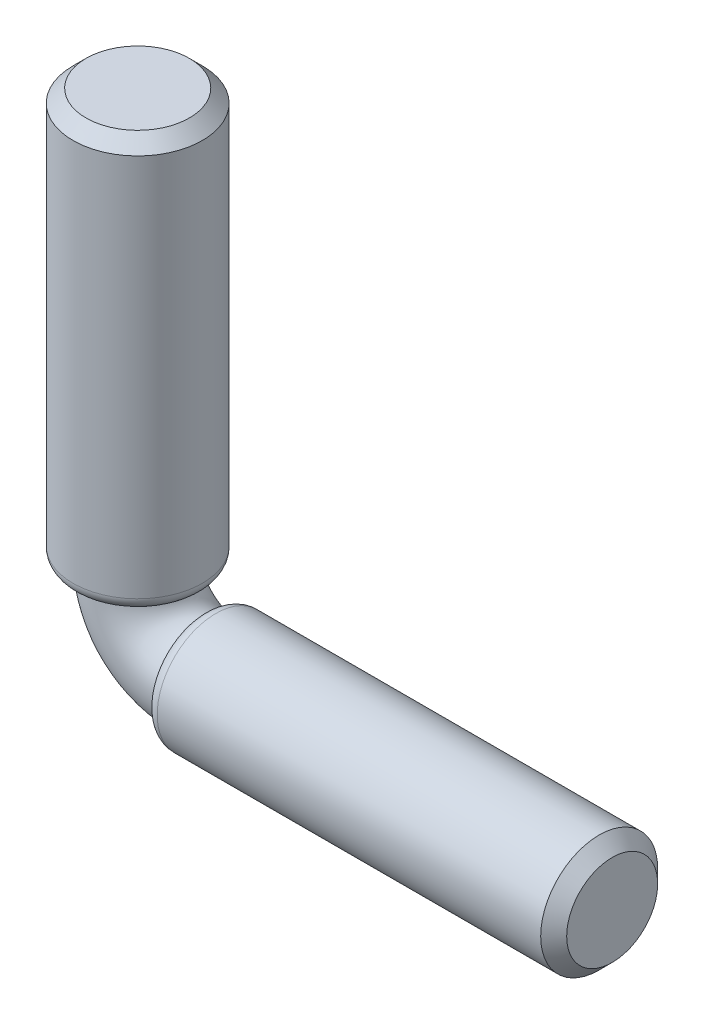
ISO-10303-21;
HEADER;
FILE_DESCRIPTION(('STEP AP214'),'2;1');
FILE_NAME('part.step','',(''),(''),'','','');
FILE_SCHEMA(('AUTOMOTIVE_DESIGN { 1 0 10303 214 1 1 1 1 }'));
ENDSEC;
DATA;
#1=APPLICATION_CONTEXT('core data for automotive mechanical design processes');
#2=APPLICATION_PROTOCOL_DEFINITION('international standard','automotive_design',2000,#1);
#3=PRODUCT_CONTEXT('',#1,'mechanical');
#4=PRODUCT('Part','Part','',(#3));
#5=PRODUCT_RELATED_PRODUCT_CATEGORY('part','',(#4));
#6=PRODUCT_DEFINITION_FORMATION('','',#4);
#7=PRODUCT_DEFINITION_CONTEXT('part definition',#1,'design');
#8=PRODUCT_DEFINITION('design','',#6,#7);
#9=PRODUCT_DEFINITION_SHAPE('','',#8);
#10=(LENGTH_UNIT() NAMED_UNIT(*) SI_UNIT(.MILLI.,.METRE.));
#11=(NAMED_UNIT(*) PLANE_ANGLE_UNIT() SI_UNIT($,.RADIAN.));
#12=(NAMED_UNIT(*) SI_UNIT($,.STERADIAN.) SOLID_ANGLE_UNIT());
#13=UNCERTAINTY_MEASURE_WITH_UNIT(LENGTH_MEASURE(1.E-05),#10,'distance_accuracy_value','');
#14=(GEOMETRIC_REPRESENTATION_CONTEXT(3) GLOBAL_UNCERTAINTY_ASSIGNED_CONTEXT((#13)) GLOBAL_UNIT_ASSIGNED_CONTEXT((#10,
#11,#12)) REPRESENTATION_CONTEXT('',''));
#15=CARTESIAN_POINT('',(0.,0.,0.));
#16=DIRECTION('',(0.,0.,1.));
#17=DIRECTION('',(1.,0.,0.));
#18=AXIS2_PLACEMENT_3D('',#15,#16,#17);
#19=CARTESIAN_POINT('',(5.,0.,0.));
#20=DIRECTION('',(0.,0.,1.));
#21=DIRECTION('',(1.,0.,0.));
#22=AXIS2_PLACEMENT_3D('',#19,#20,#21);
#23=TOROIDAL_SURFACE('',#22,5.,3.5);
#24=CARTESIAN_POINT('',(0.,0.,0.));
#25=DIRECTION('',(0.,1.,0.));
#26=DIRECTION('',(0.,0.,1.));
#27=AXIS2_PLACEMENT_3D('',#24,#25,#26);
#28=CIRCLE('',#27,3.5);
#29=CARTESIAN_POINT('',(-3.5,0.,0.));
#30=VERTEX_POINT('',#29);
#31=EDGE_CURVE('E74',#30,#30,#28,.T.);
#32=CARTESIAN_POINT('',(5.,-5.,0.));
#33=DIRECTION('',(1.,0.,0.));
#34=DIRECTION('',(0.,0.,-1.));
#35=AXIS2_PLACEMENT_3D('',#32,#33,#34);
#36=CIRCLE('',#35,3.5);
#37=CARTESIAN_POINT('',(5.00000000000001,-8.5,0.));
#38=VERTEX_POINT('',#37);
#39=EDGE_CURVE('E77',#38,#38,#36,.T.);
#40=CARTESIAN_POINT('',(5.,0.,0.));
#41=DIRECTION('',(0.,0.,1.));
#42=DIRECTION('',(1.,0.,0.));
#43=AXIS2_PLACEMENT_3D('',#40,#41,#42);
#44=CIRCLE('',#43,8.5);
#45=EDGE_CURVE('',#30,#38,#44,.T.);
#46=ORIENTED_EDGE('',*,*,#31,.F.);
#47=ORIENTED_EDGE('',*,*,#39,.F.);
#48=ORIENTED_EDGE('',*,*,#45,.T.);
#49=ORIENTED_EDGE('',*,*,#45,.F.);
#50=EDGE_LOOP('',(#46,#48,#47,#49));
#51=FACE_BOUND('',#50,.T.);
#52=ADVANCED_FACE('F45',(#51),#23,.T.);
#53=CARTESIAN_POINT('',(0.,0.,0.));
#54=DIRECTION('',(0.,1.,0.));
#55=DIRECTION('',(-1.,0.,0.));
#56=AXIS2_PLACEMENT_3D('',#53,#54,#55);
#57=CYLINDRICAL_SURFACE('',#56,4.97554770830788);
#58=CARTESIAN_POINT('',(0.,1.,0.));
#59=DIRECTION('',(0.,1.,0.));
#60=DIRECTION('',(-1.,0.,0.));
#61=AXIS2_PLACEMENT_3D('',#58,#59,#60);
#62=CIRCLE('',#61,4.97554770830788);
#63=CARTESIAN_POINT('',(-4.97554770830788,1.,0.));
#64=VERTEX_POINT('',#63);
#65=EDGE_CURVE('E52',#64,#64,#62,.T.);
#66=ORIENTED_EDGE('',*,*,#65,.T.);
#67=EDGE_LOOP('',(#66));
#68=FACE_BOUND('',#67,.T.);
#69=CARTESIAN_POINT('',(0.,30.5,0.));
#70=DIRECTION('',(0.,1.,0.));
#71=DIRECTION('',(-1.,0.,0.));
#72=AXIS2_PLACEMENT_3D('',#69,#70,#71);
#73=CIRCLE('',#72,4.97554770830788);
#74=CARTESIAN_POINT('',(-4.97554770830788,30.5,0.));
#75=VERTEX_POINT('',#74);
#76=EDGE_CURVE('E68',#75,#75,#73,.F.);
#77=ORIENTED_EDGE('',*,*,#76,.T.);
#78=EDGE_LOOP('',(#77));
#79=FACE_BOUND('',#78,.T.);
#80=ADVANCED_FACE('F86',(#68,#79),#57,.T.);
#81=CARTESIAN_POINT('',(0.,0.,0.));
#82=DIRECTION('',(0.,1.,0.));
#83=DIRECTION('',(-1.,0.,0.));
#84=AXIS2_PLACEMENT_3D('',#81,#82,#83);
#85=PLANE('',#84);
#86=CARTESIAN_POINT('',(0.,0.,0.));
#87=DIRECTION('',(0.,1.,0.));
#88=DIRECTION('',(-1.,0.,0.));
#89=AXIS2_PLACEMENT_3D('',#86,#87,#88);
#90=CIRCLE('',#89,3.97554770830788);
#91=CARTESIAN_POINT('',(-3.97554770830788,0.,0.));
#92=VERTEX_POINT('',#91);
#93=EDGE_CURVE('E11',#92,#92,#90,.F.);
#94=ORIENTED_EDGE('',*,*,#93,.T.);
#95=EDGE_LOOP('',(#94));
#96=FACE_BOUND('',#95,.T.);
#97=ORIENTED_EDGE('',*,*,#31,.T.);
#98=EDGE_LOOP('',(#97));
#99=FACE_BOUND('',#98,.T.);
#100=ADVANCED_FACE('F90',(#96,#99),#85,.F.);
#101=CARTESIAN_POINT('',(0.,31.5,0.));
#102=DIRECTION('',(0.,1.,0.));
#103=DIRECTION('',(0.,0.,1.));
#104=AXIS2_PLACEMENT_3D('',#101,#102,#103);
#105=PLANE('',#104);
#106=CARTESIAN_POINT('',(0.,31.5,0.));
#107=DIRECTION('',(0.,1.,0.));
#108=DIRECTION('',(-1.,0.,0.));
#109=AXIS2_PLACEMENT_3D('',#106,#107,#108);
#110=CIRCLE('',#109,3.97554770830786);
#111=CARTESIAN_POINT('',(-3.97554770830786,31.5,0.));
#112=VERTEX_POINT('',#111);
#113=EDGE_CURVE('E71',#112,#112,#110,.T.);
#114=ORIENTED_EDGE('',*,*,#113,.T.);
#115=EDGE_LOOP('',(#114));
#116=FACE_BOUND('',#115,.T.);
#117=ADVANCED_FACE('F92',(#116),#105,.T.);
#118=CARTESIAN_POINT('',(5.,-5.,0.));
#119=DIRECTION('',(1.,0.,0.));
#120=DIRECTION('',(0.,0.,-1.));
#121=AXIS2_PLACEMENT_3D('',#118,#119,#120);
#122=CYLINDRICAL_SURFACE('',#121,4.5);
#123=CARTESIAN_POINT('',(6.,-5.,0.));
#124=DIRECTION('',(1.,0.,0.));
#125=DIRECTION('',(0.,0.,-1.));
#126=AXIS2_PLACEMENT_3D('',#123,#124,#125);
#127=CIRCLE('',#126,4.5);
#128=CARTESIAN_POINT('',(6.,-5.,-4.5));
#129=VERTEX_POINT('',#128);
#130=EDGE_CURVE('E56',#129,#129,#127,.T.);
#131=ORIENTED_EDGE('',*,*,#130,.T.);
#132=EDGE_LOOP('',(#131));
#133=FACE_BOUND('',#132,.T.);
#134=CARTESIAN_POINT('',(35.5,-5.,0.));
#135=DIRECTION('',(-1.,0.,0.));
#136=DIRECTION('',(0.,0.,1.));
#137=AXIS2_PLACEMENT_3D('',#134,#135,#136);
#138=CIRCLE('',#137,4.5);
#139=CARTESIAN_POINT('',(35.5,-5.,4.5));
#140=VERTEX_POINT('',#139);
#141=EDGE_CURVE('E60',#140,#140,#138,.T.);
#142=ORIENTED_EDGE('',*,*,#141,.T.);
#143=EDGE_LOOP('',(#142));
#144=FACE_BOUND('',#143,.T.);
#145=ADVANCED_FACE('F99',(#133,#144),#122,.T.);
#146=CARTESIAN_POINT('',(36.5,-5.,0.));
#147=DIRECTION('',(-1.,0.,0.));
#148=DIRECTION('',(0.,0.,1.));
#149=AXIS2_PLACEMENT_3D('',#146,#147,#148);
#150=PLANE('',#149);
#151=CARTESIAN_POINT('',(36.5,-5.,0.));
#152=DIRECTION('',(-1.,0.,0.));
#153=DIRECTION('',(0.,0.,1.));
#154=AXIS2_PLACEMENT_3D('',#151,#152,#153);
#155=CIRCLE('',#154,3.49999999999999);
#156=CARTESIAN_POINT('',(36.5,-5.,3.49999999999999));
#157=VERTEX_POINT('',#156);
#158=EDGE_CURVE('E65',#157,#157,#155,.F.);
#159=ORIENTED_EDGE('',*,*,#158,.T.);
#160=EDGE_LOOP('',(#159));
#161=FACE_BOUND('',#160,.T.);
#162=ADVANCED_FACE('F105',(#161),#150,.F.);
#163=CARTESIAN_POINT('',(0.,31.5,0.));
#164=DIRECTION('',(0.,-1.,0.));
#165=DIRECTION('',(1.,0.,0.));
#166=AXIS2_PLACEMENT_3D('',#163,#164,#165);
#167=CONICAL_SURFACE('',#166,3.97554770830786,0.785398163397453);
#168=ORIENTED_EDGE('',*,*,#76,.F.);
#169=EDGE_LOOP('',(#168));
#170=FACE_BOUND('',#169,.T.);
#171=ORIENTED_EDGE('',*,*,#113,.F.);
#172=EDGE_LOOP('',(#171));
#173=FACE_BOUND('',#172,.T.);
#174=ADVANCED_FACE('F107',(#170,#173),#167,.T.);
#175=CARTESIAN_POINT('',(36.5,-5.,0.));
#176=DIRECTION('',(-1.,0.,0.));
#177=DIRECTION('',(0.,0.,1.));
#178=AXIS2_PLACEMENT_3D('',#175,#176,#177);
#179=CONICAL_SURFACE('',#178,3.49999999999999,0.785398163397446);
#180=ORIENTED_EDGE('',*,*,#141,.F.);
#181=EDGE_LOOP('',(#180));
#182=FACE_BOUND('',#181,.T.);
#183=ORIENTED_EDGE('',*,*,#158,.F.);
#184=EDGE_LOOP('',(#183));
#185=FACE_BOUND('',#184,.T.);
#186=ADVANCED_FACE('F116',(#182,#185),#179,.T.);
#187=CARTESIAN_POINT('',(6.,-5.,0.));
#188=DIRECTION('',(1.,0.,0.));
#189=DIRECTION('',(0.,0.,-1.));
#190=AXIS2_PLACEMENT_3D('',#187,#188,#189);
#191=TOROIDAL_SURFACE('',#190,3.5,1.);
#192=ORIENTED_EDGE('',*,*,#39,.T.);
#193=EDGE_LOOP('',(#192));
#194=FACE_BOUND('',#193,.T.);
#195=ORIENTED_EDGE('',*,*,#130,.F.);
#196=EDGE_LOOP('',(#195));
#197=FACE_BOUND('',#196,.T.);
#198=ADVANCED_FACE('F81',(#194,#197),#191,.T.);
#199=CARTESIAN_POINT('',(0.,1.,0.));
#200=DIRECTION('',(0.,1.,0.));
#201=DIRECTION('',(-1.,0.,0.));
#202=AXIS2_PLACEMENT_3D('',#199,#200,#201);
#203=TOROIDAL_SURFACE('',#202,3.97554770830788,1.);
#204=ORIENTED_EDGE('',*,*,#93,.F.);
#205=EDGE_LOOP('',(#204));
#206=FACE_BOUND('',#205,.T.);
#207=ORIENTED_EDGE('',*,*,#65,.F.);
#208=EDGE_LOOP('',(#207));
#209=FACE_BOUND('',#208,.T.);
#210=ADVANCED_FACE('F47',(#206,#209),#203,.T.);
#211=CLOSED_SHELL('',(#52,#80,#100,#117,#145,#162,#174,#186,#198,#210));
#212=MANIFOLD_SOLID_BREP('B2',#211);
#213=ADVANCED_BREP_SHAPE_REPRESENTATION('',(#18,#212),#14);
#214=SHAPE_DEFINITION_REPRESENTATION(#9,#213);
ENDSEC;
END-ISO-10303-21;
